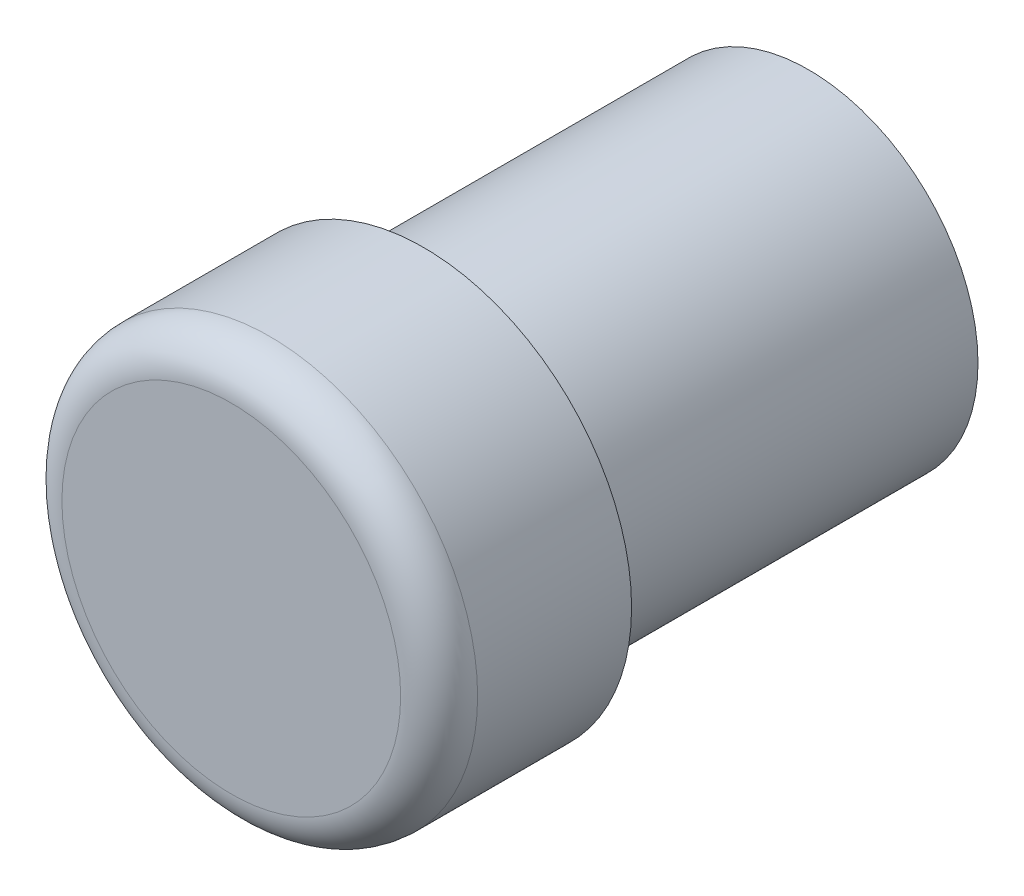
ISO-10303-21;
HEADER;
FILE_DESCRIPTION(('STEP AP214'),'2;1');
FILE_NAME('part.step','',(''),(''),'','','');
FILE_SCHEMA(('AUTOMOTIVE_DESIGN { 1 0 10303 214 1 1 1 1 }'));
ENDSEC;
DATA;
#1=APPLICATION_CONTEXT('core data for automotive mechanical design processes');
#2=APPLICATION_PROTOCOL_DEFINITION('international standard','automotive_design',2000,#1);
#3=PRODUCT_CONTEXT('',#1,'mechanical');
#4=PRODUCT('Part','Part','',(#3));
#5=PRODUCT_RELATED_PRODUCT_CATEGORY('part','',(#4));
#6=PRODUCT_DEFINITION_FORMATION('','',#4);
#7=PRODUCT_DEFINITION_CONTEXT('part definition',#1,'design');
#8=PRODUCT_DEFINITION('design','',#6,#7);
#9=PRODUCT_DEFINITION_SHAPE('','',#8);
#10=(LENGTH_UNIT() NAMED_UNIT(*) SI_UNIT(.MILLI.,.METRE.));
#11=(NAMED_UNIT(*) PLANE_ANGLE_UNIT() SI_UNIT($,.RADIAN.));
#12=(NAMED_UNIT(*) SI_UNIT($,.STERADIAN.) SOLID_ANGLE_UNIT());
#13=UNCERTAINTY_MEASURE_WITH_UNIT(LENGTH_MEASURE(1.E-05),#10,'distance_accuracy_value','');
#14=(GEOMETRIC_REPRESENTATION_CONTEXT(3) GLOBAL_UNCERTAINTY_ASSIGNED_CONTEXT((#13)) GLOBAL_UNIT_ASSIGNED_CONTEXT((#10,
#11,#12)) REPRESENTATION_CONTEXT('',''));
#15=CARTESIAN_POINT('',(0.,0.,0.));
#16=DIRECTION('',(0.,0.,1.));
#17=DIRECTION('',(1.,0.,0.));
#18=AXIS2_PLACEMENT_3D('',#15,#16,#17);
#19=CARTESIAN_POINT('',(0.,0.,10.));
#20=DIRECTION('',(0.,0.,-1.));
#21=DIRECTION('',(-1.,0.,0.));
#22=AXIS2_PLACEMENT_3D('',#19,#20,#21);
#23=CYLINDRICAL_SURFACE('',#22,10.8);
#24=CARTESIAN_POINT('',(0.,0.,8.));
#25=DIRECTION('',(0.,0.,1.));
#26=DIRECTION('',(1.,0.,0.));
#27=AXIS2_PLACEMENT_3D('',#24,#25,#26);
#28=CIRCLE('',#27,10.8);
#29=CARTESIAN_POINT('',(10.8,0.,8.));
#30=VERTEX_POINT('',#29);
#31=EDGE_CURVE('E10',#30,#30,#28,.F.);
#32=ORIENTED_EDGE('',*,*,#31,.T.);
#33=EDGE_LOOP('',(#32));
#34=FACE_BOUND('',#33,.T.);
#35=CARTESIAN_POINT('',(0.,0.,0.));
#36=DIRECTION('',(0.,0.,1.));
#37=DIRECTION('',(1.,0.,0.));
#38=AXIS2_PLACEMENT_3D('',#35,#36,#37);
#39=CIRCLE('',#38,10.8);
#40=CARTESIAN_POINT('',(10.8,0.,0.));
#41=VERTEX_POINT('',#40);
#42=EDGE_CURVE('E55',#41,#41,#39,.T.);
#43=ORIENTED_EDGE('',*,*,#42,.T.);
#44=EDGE_LOOP('',(#43));
#45=FACE_BOUND('',#44,.T.);
#46=ADVANCED_FACE('F40',(#34,#45),#23,.T.);
#47=CARTESIAN_POINT('',(0.,0.,10.));
#48=DIRECTION('',(0.,0.,1.));
#49=DIRECTION('',(1.,0.,0.));
#50=AXIS2_PLACEMENT_3D('',#47,#48,#49);
#51=PLANE('',#50);
#52=CARTESIAN_POINT('',(0.,0.,10.));
#53=DIRECTION('',(0.,0.,1.));
#54=DIRECTION('',(1.,0.,0.));
#55=AXIS2_PLACEMENT_3D('',#52,#53,#54);
#56=CIRCLE('',#55,8.8);
#57=CARTESIAN_POINT('',(8.8,0.,10.));
#58=VERTEX_POINT('',#57);
#59=EDGE_CURVE('E47',#58,#58,#56,.T.);
#60=ORIENTED_EDGE('',*,*,#59,.T.);
#61=EDGE_LOOP('',(#60));
#62=FACE_BOUND('',#61,.T.);
#63=ADVANCED_FACE('F93',(#62),#51,.T.);
#64=CARTESIAN_POINT('',(0.,0.,0.));
#65=DIRECTION('',(0.,0.,1.));
#66=DIRECTION('',(1.,0.,0.));
#67=AXIS2_PLACEMENT_3D('',#64,#65,#66);
#68=PLANE('',#67);
#69=CARTESIAN_POINT('',(0.,0.,0.));
#70=DIRECTION('',(0.,0.,-1.));
#71=DIRECTION('',(-1.,0.,0.));
#72=AXIS2_PLACEMENT_3D('',#69,#70,#71);
#73=CIRCLE('',#72,8.8);
#74=CARTESIAN_POINT('',(-8.8,0.,0.));
#75=VERTEX_POINT('',#74);
#76=EDGE_CURVE('E51',#75,#75,#73,.T.);
#77=ORIENTED_EDGE('',*,*,#76,.F.);
#78=EDGE_LOOP('',(#77));
#79=FACE_BOUND('',#78,.T.);
#80=ORIENTED_EDGE('',*,*,#42,.F.);
#81=EDGE_LOOP('',(#80));
#82=FACE_BOUND('',#81,.T.);
#83=ADVANCED_FACE('F87',(#79,#82),#68,.F.);
#84=CARTESIAN_POINT('',(0.,0.,-20.));
#85=DIRECTION('',(0.,0.,1.));
#86=DIRECTION('',(1.,0.,0.));
#87=AXIS2_PLACEMENT_3D('',#84,#85,#86);
#88=CYLINDRICAL_SURFACE('',#87,8.8);
#89=CARTESIAN_POINT('',(0.,0.,-20.));
#90=DIRECTION('',(0.,0.,-1.));
#91=DIRECTION('',(-1.,0.,0.));
#92=AXIS2_PLACEMENT_3D('',#89,#90,#91);
#93=CIRCLE('',#92,8.8);
#94=CARTESIAN_POINT('',(-8.8,0.,-20.));
#95=VERTEX_POINT('',#94);
#96=EDGE_CURVE('E59',#95,#95,#93,.T.);
#97=ORIENTED_EDGE('',*,*,#96,.F.);
#98=EDGE_LOOP('',(#97));
#99=FACE_BOUND('',#98,.T.);
#100=ORIENTED_EDGE('',*,*,#76,.T.);
#101=EDGE_LOOP('',(#100));
#102=FACE_BOUND('',#101,.T.);
#103=ADVANCED_FACE('F81',(#99,#102),#88,.T.);
#104=CARTESIAN_POINT('',(0.,0.,-20.));
#105=DIRECTION('',(0.,0.,-1.));
#106=DIRECTION('',(-1.,0.,0.));
#107=AXIS2_PLACEMENT_3D('',#104,#105,#106);
#108=PLANE('',#107);
#109=CARTESIAN_POINT('',(0.,0.,-20.));
#110=DIRECTION('',(0.,0.,-1.));
#111=DIRECTION('',(-1.,0.,0.));
#112=AXIS2_PLACEMENT_3D('',#109,#110,#111);
#113=CIRCLE('',#112,2.);
#114=CARTESIAN_POINT('',(-2.,0.,-20.));
#115=VERTEX_POINT('',#114);
#116=EDGE_CURVE('E64',#115,#115,#113,.T.);
#117=ORIENTED_EDGE('',*,*,#116,.F.);
#118=EDGE_LOOP('',(#117));
#119=FACE_BOUND('',#118,.T.);
#120=ORIENTED_EDGE('',*,*,#96,.T.);
#121=EDGE_LOOP('',(#120));
#122=FACE_BOUND('',#121,.T.);
#123=ADVANCED_FACE('F78',(#119,#122),#108,.T.);
#124=CARTESIAN_POINT('',(0.,0.,8.));
#125=DIRECTION('',(0.,0.,1.));
#126=DIRECTION('',(1.,0.,0.));
#127=AXIS2_PLACEMENT_3D('',#124,#125,#126);
#128=TOROIDAL_SURFACE('',#127,8.8,2.);
#129=ORIENTED_EDGE('',*,*,#31,.F.);
#130=EDGE_LOOP('',(#129));
#131=FACE_BOUND('',#130,.T.);
#132=ORIENTED_EDGE('',*,*,#59,.F.);
#133=EDGE_LOOP('',(#132));
#134=FACE_BOUND('',#133,.T.);
#135=ADVANCED_FACE('F42',(#131,#134),#128,.T.);
#136=CARTESIAN_POINT('',(0.,0.,-10.));
#137=DIRECTION('',(0.,0.,-1.));
#138=DIRECTION('',(-1.,0.,0.));
#139=AXIS2_PLACEMENT_3D('',#136,#137,#138);
#140=CYLINDRICAL_SURFACE('',#139,2.);
#141=CARTESIAN_POINT('',(0.,0.,-10.));
#142=DIRECTION('',(0.,0.,-1.));
#143=DIRECTION('',(-1.,0.,0.));
#144=AXIS2_PLACEMENT_3D('',#141,#142,#143);
#145=CIRCLE('',#144,2.);
#146=CARTESIAN_POINT('',(-2.,0.,-10.));
#147=VERTEX_POINT('',#146);
#148=EDGE_CURVE('E63',#147,#147,#145,.T.);
#149=ORIENTED_EDGE('',*,*,#148,.F.);
#150=EDGE_LOOP('',(#149));
#151=FACE_BOUND('',#150,.T.);
#152=ORIENTED_EDGE('',*,*,#116,.T.);
#153=EDGE_LOOP('',(#152));
#154=FACE_BOUND('',#153,.T.);
#155=ADVANCED_FACE('F72',(#151,#154),#140,.F.);
#156=CARTESIAN_POINT('',(0.,0.,-10.));
#157=DIRECTION('',(0.,0.,-1.));
#158=DIRECTION('',(-1.,0.,0.));
#159=AXIS2_PLACEMENT_3D('',#156,#157,#158);
#160=PLANE('',#159);
#161=ORIENTED_EDGE('',*,*,#148,.T.);
#162=EDGE_LOOP('',(#161));
#163=FACE_BOUND('',#162,.T.);
#164=ADVANCED_FACE('F70',(#163),#160,.T.);
#165=CLOSED_SHELL('',(#46,#63,#83,#103,#123,#135,#155,#164));
#166=MANIFOLD_SOLID_BREP('B2',#165);
#167=ADVANCED_BREP_SHAPE_REPRESENTATION('',(#18,#166),#14);
#168=SHAPE_DEFINITION_REPRESENTATION(#9,#167);
ENDSEC;
END-ISO-10303-21;
